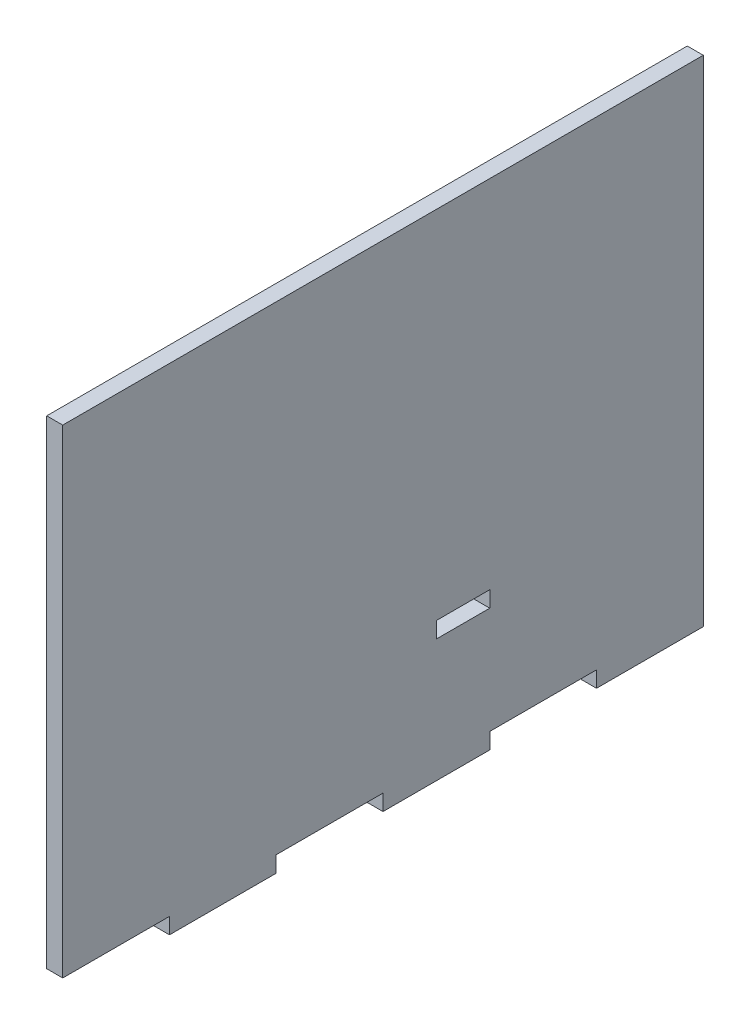
ISO-10303-21;
HEADER;
FILE_DESCRIPTION(('STEP AP214'),'2;1');
FILE_NAME('part.step','',(''),(''),'','','');
FILE_SCHEMA(('AUTOMOTIVE_DESIGN { 1 0 10303 214 1 1 1 1 }'));
ENDSEC;
DATA;
#1=APPLICATION_CONTEXT('core data for automotive mechanical design processes');
#2=APPLICATION_PROTOCOL_DEFINITION('international standard','automotive_design',2000,#1);
#3=PRODUCT_CONTEXT('',#1,'mechanical');
#4=PRODUCT('Part','Part','',(#3));
#5=PRODUCT_RELATED_PRODUCT_CATEGORY('part','',(#4));
#6=PRODUCT_DEFINITION_FORMATION('','',#4);
#7=PRODUCT_DEFINITION_CONTEXT('part definition',#1,'design');
#8=PRODUCT_DEFINITION('design','',#6,#7);
#9=PRODUCT_DEFINITION_SHAPE('','',#8);
#10=(LENGTH_UNIT() NAMED_UNIT(*) SI_UNIT(.MILLI.,.METRE.));
#11=(NAMED_UNIT(*) PLANE_ANGLE_UNIT() SI_UNIT($,.RADIAN.));
#12=(NAMED_UNIT(*) SI_UNIT($,.STERADIAN.) SOLID_ANGLE_UNIT());
#13=UNCERTAINTY_MEASURE_WITH_UNIT(LENGTH_MEASURE(1.E-05),#10,'distance_accuracy_value','');
#14=(GEOMETRIC_REPRESENTATION_CONTEXT(3) GLOBAL_UNCERTAINTY_ASSIGNED_CONTEXT((#13)) GLOBAL_UNIT_ASSIGNED_CONTEXT((#10,
#11,#12)) REPRESENTATION_CONTEXT('',''));
#15=CARTESIAN_POINT('',(0.,0.,0.));
#16=DIRECTION('',(0.,0.,1.));
#17=DIRECTION('',(1.,0.,0.));
#18=AXIS2_PLACEMENT_3D('',#15,#16,#17);
#19=CARTESIAN_POINT('',(3.,-58.6201993364482,0.));
#20=DIRECTION('',(0.,-1.,0.));
#21=DIRECTION('',(0.,0.,-1.));
#22=AXIS2_PLACEMENT_3D('',#19,#20,#21);
#23=PLANE('',#22);
#24=DIRECTION('',(0.,0.,1.));
#25=VECTOR('',#24,1.);
#26=CARTESIAN_POINT('',(0.,-58.6201993364482,0.));
#27=LINE('',#26,#25);
#28=CARTESIAN_POINT('',(0.,-58.6201993364482,-19.4698561832748));
#29=VERTEX_POINT('',#28);
#30=CARTESIAN_POINT('',(0.,-58.6201993364482,-9.4698561832748));
#31=VERTEX_POINT('',#30);
#32=EDGE_CURVE('E221',#29,#31,#27,.T.);
#33=ORIENTED_EDGE('',*,*,#32,.T.);
#34=DIRECTION('',(-1.,0.,0.));
#35=VECTOR('',#34,1.);
#36=CARTESIAN_POINT('',(3.,-58.6201993364482,-9.4698561832748));
#37=LINE('',#36,#35);
#38=CARTESIAN_POINT('',(3.,-58.6201993364482,-9.4698561832748));
#39=VERTEX_POINT('',#38);
#40=EDGE_CURVE('E11',#39,#31,#37,.T.);
#41=ORIENTED_EDGE('',*,*,#40,.F.);
#42=DIRECTION('',(0.,0.,1.));
#43=VECTOR('',#42,1.);
#44=CARTESIAN_POINT('',(3.,-58.6201993364482,0.));
#45=LINE('',#44,#43);
#46=CARTESIAN_POINT('',(3.,-58.6201993364482,-19.4698561832748));
#47=VERTEX_POINT('',#46);
#48=EDGE_CURVE('E173',#47,#39,#45,.T.);
#49=ORIENTED_EDGE('',*,*,#48,.F.);
#50=DIRECTION('',(-1.,0.,0.));
#51=VECTOR('',#50,1.);
#52=CARTESIAN_POINT('',(3.,-58.6201993364482,-19.4698561832748));
#53=LINE('',#52,#51);
#54=EDGE_CURVE('E53',#47,#29,#53,.T.);
#55=ORIENTED_EDGE('',*,*,#54,.T.);
#56=EDGE_LOOP('',(#33,#41,#49,#55));
#57=FACE_BOUND('',#56,.T.);
#58=ADVANCED_FACE('F34',(#57),#23,.F.);
#59=CARTESIAN_POINT('',(3.,0.,-9.4698561832748));
#60=DIRECTION('',(0.,0.,1.));
#61=DIRECTION('',(1.,0.,0.));
#62=AXIS2_PLACEMENT_3D('',#59,#60,#61);
#63=PLANE('',#62);
#64=DIRECTION('',(0.,1.,0.));
#65=VECTOR('',#64,1.);
#66=CARTESIAN_POINT('',(0.,0.,-9.4698561832748));
#67=LINE('',#66,#65);
#68=CARTESIAN_POINT('',(0.,-55.6201993364482,-9.4698561832748));
#69=VERTEX_POINT('',#68);
#70=EDGE_CURVE('E179',#31,#69,#67,.T.);
#71=ORIENTED_EDGE('',*,*,#70,.T.);
#72=DIRECTION('',(-1.,0.,0.));
#73=VECTOR('',#72,1.);
#74=CARTESIAN_POINT('',(3.,-55.6201993364482,-9.4698561832748));
#75=LINE('',#74,#73);
#76=CARTESIAN_POINT('',(3.,-55.6201993364482,-9.4698561832748));
#77=VERTEX_POINT('',#76);
#78=EDGE_CURVE('E44',#77,#69,#75,.T.);
#79=ORIENTED_EDGE('',*,*,#78,.F.);
#80=DIRECTION('',(0.,1.,0.));
#81=VECTOR('',#80,1.);
#82=CARTESIAN_POINT('',(3.,0.,-9.4698561832748));
#83=LINE('',#82,#81);
#84=EDGE_CURVE('E167',#39,#77,#83,.T.);
#85=ORIENTED_EDGE('',*,*,#84,.F.);
#86=ORIENTED_EDGE('',*,*,#40,.T.);
#87=EDGE_LOOP('',(#71,#79,#85,#86));
#88=FACE_BOUND('',#87,.T.);
#89=ADVANCED_FACE('F178',(#88),#63,.F.);
#90=CARTESIAN_POINT('',(3.,-55.6201993364482,0.));
#91=DIRECTION('',(0.,-1.,0.));
#92=DIRECTION('',(0.,0.,-1.));
#93=AXIS2_PLACEMENT_3D('',#90,#91,#92);
#94=PLANE('',#93);
#95=DIRECTION('',(0.,0.,1.));
#96=VECTOR('',#95,1.);
#97=CARTESIAN_POINT('',(0.,-55.6201993364482,0.));
#98=LINE('',#97,#96);
#99=CARTESIAN_POINT('',(0.,-55.6201993364482,-19.4698561832748));
#100=VERTEX_POINT('',#99);
#101=EDGE_CURVE('E224',#100,#69,#98,.T.);
#102=ORIENTED_EDGE('',*,*,#101,.F.);
#103=DIRECTION('',(-1.,0.,0.));
#104=VECTOR('',#103,1.);
#105=CARTESIAN_POINT('',(3.,-55.6201993364482,-19.4698561832748));
#106=LINE('',#105,#104);
#107=CARTESIAN_POINT('',(3.,-55.6201993364482,-19.4698561832748));
#108=VERTEX_POINT('',#107);
#109=EDGE_CURVE('E109',#108,#100,#106,.T.);
#110=ORIENTED_EDGE('',*,*,#109,.F.);
#111=DIRECTION('',(0.,0.,1.));
#112=VECTOR('',#111,1.);
#113=CARTESIAN_POINT('',(3.,-55.6201993364482,0.));
#114=LINE('',#113,#112);
#115=EDGE_CURVE('E172',#108,#77,#114,.T.);
#116=ORIENTED_EDGE('',*,*,#115,.T.);
#117=ORIENTED_EDGE('',*,*,#78,.T.);
#118=EDGE_LOOP('',(#102,#110,#116,#117));
#119=FACE_BOUND('',#118,.T.);
#120=ADVANCED_FACE('F183',(#119),#94,.T.);
#121=CARTESIAN_POINT('',(3.,11.0868676877824,0.));
#122=DIRECTION('',(0.,1.,0.));
#123=DIRECTION('',(0.,0.,1.));
#124=AXIS2_PLACEMENT_3D('',#121,#122,#123);
#125=PLANE('',#124);
#126=DIRECTION('',(0.,0.,-1.));
#127=VECTOR('',#126,1.);
#128=CARTESIAN_POINT('',(0.,11.0868676877824,0.));
#129=LINE('',#128,#127);
#130=CARTESIAN_POINT('',(0.,11.0868676877824,60.5301438167252));
#131=VERTEX_POINT('',#130);
#132=CARTESIAN_POINT('',(0.,11.0868676877824,-59.4698561832748));
#133=VERTEX_POINT('',#132);
#134=EDGE_CURVE('E190',#131,#133,#129,.T.);
#135=ORIENTED_EDGE('',*,*,#134,.F.);
#136=DIRECTION('',(-1.,0.,0.));
#137=VECTOR('',#136,1.);
#138=CARTESIAN_POINT('',(3.,11.0868676877824,60.5301438167252));
#139=LINE('',#138,#137);
#140=CARTESIAN_POINT('',(3.,11.0868676877824,60.5301438167252));
#141=VERTEX_POINT('',#140);
#142=EDGE_CURVE('E38',#141,#131,#139,.T.);
#143=ORIENTED_EDGE('',*,*,#142,.F.);
#144=DIRECTION('',(0.,0.,-1.));
#145=VECTOR('',#144,1.);
#146=CARTESIAN_POINT('',(3.,11.0868676877824,0.));
#147=LINE('',#146,#145);
#148=CARTESIAN_POINT('',(3.,11.0868676877824,-59.4698561832748));
#149=VERTEX_POINT('',#148);
#150=EDGE_CURVE('E229',#141,#149,#147,.T.);
#151=ORIENTED_EDGE('',*,*,#150,.T.);
#152=DIRECTION('',(-1.,0.,0.));
#153=VECTOR('',#152,1.);
#154=CARTESIAN_POINT('',(3.,11.0868676877824,-59.4698561832748));
#155=LINE('',#154,#153);
#156=EDGE_CURVE('E186',#149,#133,#155,.T.);
#157=ORIENTED_EDGE('',*,*,#156,.T.);
#158=EDGE_LOOP('',(#135,#143,#151,#157));
#159=FACE_BOUND('',#158,.T.);
#160=ADVANCED_FACE('F36',(#159),#125,.T.);
#161=CARTESIAN_POINT('',(3.,0.,60.5301438167252));
#162=DIRECTION('',(0.,0.,1.));
#163=DIRECTION('',(1.,0.,0.));
#164=AXIS2_PLACEMENT_3D('',#161,#162,#163);
#165=PLANE('',#164);
#166=DIRECTION('',(0.,1.,0.));
#167=VECTOR('',#166,1.);
#168=CARTESIAN_POINT('',(0.,0.,60.5301438167252));
#169=LINE('',#168,#167);
#170=CARTESIAN_POINT('',(0.,-78.6201993364482,60.5301438167252));
#171=VERTEX_POINT('',#170);
#172=EDGE_CURVE('E193',#171,#131,#169,.T.);
#173=ORIENTED_EDGE('',*,*,#172,.F.);
#174=DIRECTION('',(-1.,0.,0.));
#175=VECTOR('',#174,1.);
#176=CARTESIAN_POINT('',(3.,-78.6201993364482,60.5301438167252));
#177=LINE('',#176,#175);
#178=CARTESIAN_POINT('',(3.,-78.6201993364482,60.5301438167252));
#179=VERTEX_POINT('',#178);
#180=EDGE_CURVE('E265',#179,#171,#177,.T.);
#181=ORIENTED_EDGE('',*,*,#180,.F.);
#182=DIRECTION('',(0.,1.,0.));
#183=VECTOR('',#182,1.);
#184=CARTESIAN_POINT('',(3.,0.,60.5301438167252));
#185=LINE('',#184,#183);
#186=EDGE_CURVE('E274',#179,#141,#185,.T.);
#187=ORIENTED_EDGE('',*,*,#186,.T.);
#188=ORIENTED_EDGE('',*,*,#142,.T.);
#189=EDGE_LOOP('',(#173,#181,#187,#188));
#190=FACE_BOUND('',#189,.T.);
#191=ADVANCED_FACE('F272',(#190),#165,.T.);
#192=CARTESIAN_POINT('',(3.,-78.6201993364482,0.));
#193=DIRECTION('',(0.,1.,0.));
#194=DIRECTION('',(0.,0.,1.));
#195=AXIS2_PLACEMENT_3D('',#192,#193,#194);
#196=PLANE('',#195);
#197=DIRECTION('',(0.,0.,-1.));
#198=VECTOR('',#197,1.);
#199=CARTESIAN_POINT('',(0.,-78.6201993364482,0.));
#200=LINE('',#199,#198);
#201=CARTESIAN_POINT('',(0.,-78.6201993364482,40.5301438167252));
#202=VERTEX_POINT('',#201);
#203=EDGE_CURVE('E196',#171,#202,#200,.T.);
#204=ORIENTED_EDGE('',*,*,#203,.T.);
#205=DIRECTION('',(-1.,0.,0.));
#206=VECTOR('',#205,1.);
#207=CARTESIAN_POINT('',(3.,-78.6201993364482,40.5301438167252));
#208=LINE('',#207,#206);
#209=CARTESIAN_POINT('',(3.,-78.6201993364482,40.5301438167252));
#210=VERTEX_POINT('',#209);
#211=EDGE_CURVE('E263',#210,#202,#208,.T.);
#212=ORIENTED_EDGE('',*,*,#211,.F.);
#213=DIRECTION('',(0.,0.,-1.));
#214=VECTOR('',#213,1.);
#215=CARTESIAN_POINT('',(3.,-78.6201993364482,0.));
#216=LINE('',#215,#214);
#217=EDGE_CURVE('E292',#179,#210,#216,.T.);
#218=ORIENTED_EDGE('',*,*,#217,.F.);
#219=ORIENTED_EDGE('',*,*,#180,.T.);
#220=EDGE_LOOP('',(#204,#212,#218,#219));
#221=FACE_BOUND('',#220,.T.);
#222=ADVANCED_FACE('F283',(#221),#196,.F.);
#223=CARTESIAN_POINT('',(3.,0.,40.5301438167252));
#224=DIRECTION('',(0.,0.,-1.));
#225=DIRECTION('',(-1.,0.,0.));
#226=AXIS2_PLACEMENT_3D('',#223,#224,#225);
#227=PLANE('',#226);
#228=DIRECTION('',(0.,-1.,0.));
#229=VECTOR('',#228,1.);
#230=CARTESIAN_POINT('',(0.,0.,40.5301438167252));
#231=LINE('',#230,#229);
#232=CARTESIAN_POINT('',(0.,-81.6201993364482,40.5301438167252));
#233=VERTEX_POINT('',#232);
#234=EDGE_CURVE('E198',#202,#233,#231,.T.);
#235=ORIENTED_EDGE('',*,*,#234,.T.);
#236=DIRECTION('',(-1.,0.,0.));
#237=VECTOR('',#236,1.);
#238=CARTESIAN_POINT('',(3.,-81.6201993364482,40.5301438167252));
#239=LINE('',#238,#237);
#240=CARTESIAN_POINT('',(3.,-81.6201993364482,40.5301438167252));
#241=VERTEX_POINT('',#240);
#242=EDGE_CURVE('E260',#241,#233,#239,.T.);
#243=ORIENTED_EDGE('',*,*,#242,.F.);
#244=DIRECTION('',(0.,-1.,0.));
#245=VECTOR('',#244,1.);
#246=CARTESIAN_POINT('',(3.,0.,40.5301438167252));
#247=LINE('',#246,#245);
#248=EDGE_CURVE('E288',#210,#241,#247,.T.);
#249=ORIENTED_EDGE('',*,*,#248,.F.);
#250=ORIENTED_EDGE('',*,*,#211,.T.);
#251=EDGE_LOOP('',(#235,#243,#249,#250));
#252=FACE_BOUND('',#251,.T.);
#253=ADVANCED_FACE('F286',(#252),#227,.F.);
#254=CARTESIAN_POINT('',(3.,-81.6201993364482,0.));
#255=DIRECTION('',(0.,1.,0.));
#256=DIRECTION('',(0.,0.,1.));
#257=AXIS2_PLACEMENT_3D('',#254,#255,#256);
#258=PLANE('',#257);
#259=DIRECTION('',(0.,0.,-1.));
#260=VECTOR('',#259,1.);
#261=CARTESIAN_POINT('',(0.,-81.6201993364482,0.));
#262=LINE('',#261,#260);
#263=CARTESIAN_POINT('',(0.,-81.6201993364482,20.5301438167252));
#264=VERTEX_POINT('',#263);
#265=EDGE_CURVE('E200',#233,#264,#262,.T.);
#266=ORIENTED_EDGE('',*,*,#265,.T.);
#267=DIRECTION('',(-1.,0.,0.));
#268=VECTOR('',#267,1.);
#269=CARTESIAN_POINT('',(3.,-81.6201993364482,20.5301438167252));
#270=LINE('',#269,#268);
#271=CARTESIAN_POINT('',(3.,-81.6201993364482,20.5301438167252));
#272=VERTEX_POINT('',#271);
#273=EDGE_CURVE('E257',#272,#264,#270,.T.);
#274=ORIENTED_EDGE('',*,*,#273,.F.);
#275=DIRECTION('',(0.,0.,-1.));
#276=VECTOR('',#275,1.);
#277=CARTESIAN_POINT('',(3.,-81.6201993364482,0.));
#278=LINE('',#277,#276);
#279=EDGE_CURVE('E291',#241,#272,#278,.T.);
#280=ORIENTED_EDGE('',*,*,#279,.F.);
#281=ORIENTED_EDGE('',*,*,#242,.T.);
#282=EDGE_LOOP('',(#266,#274,#280,#281));
#283=FACE_BOUND('',#282,.T.);
#284=ADVANCED_FACE('F361',(#283),#258,.F.);
#285=CARTESIAN_POINT('',(3.,0.,20.5301438167252));
#286=DIRECTION('',(0.,0.,1.));
#287=DIRECTION('',(1.,0.,0.));
#288=AXIS2_PLACEMENT_3D('',#285,#286,#287);
#289=PLANE('',#288);
#290=DIRECTION('',(0.,1.,0.));
#291=VECTOR('',#290,1.);
#292=CARTESIAN_POINT('',(0.,0.,20.5301438167252));
#293=LINE('',#292,#291);
#294=CARTESIAN_POINT('',(0.,-78.6201993364482,20.5301438167252));
#295=VERTEX_POINT('',#294);
#296=EDGE_CURVE('E202',#264,#295,#293,.T.);
#297=ORIENTED_EDGE('',*,*,#296,.T.);
#298=DIRECTION('',(-1.,0.,0.));
#299=VECTOR('',#298,1.);
#300=CARTESIAN_POINT('',(3.,-78.6201993364482,20.5301438167252));
#301=LINE('',#300,#299);
#302=CARTESIAN_POINT('',(3.,-78.6201993364482,20.5301438167252));
#303=VERTEX_POINT('',#302);
#304=EDGE_CURVE('E254',#303,#295,#301,.T.);
#305=ORIENTED_EDGE('',*,*,#304,.F.);
#306=DIRECTION('',(0.,1.,0.));
#307=VECTOR('',#306,1.);
#308=CARTESIAN_POINT('',(3.,0.,20.5301438167252));
#309=LINE('',#308,#307);
#310=EDGE_CURVE('E294',#272,#303,#309,.T.);
#311=ORIENTED_EDGE('',*,*,#310,.F.);
#312=ORIENTED_EDGE('',*,*,#273,.T.);
#313=EDGE_LOOP('',(#297,#305,#311,#312));
#314=FACE_BOUND('',#313,.T.);
#315=ADVANCED_FACE('F358',(#314),#289,.F.);
#316=CARTESIAN_POINT('',(3.,-78.6201993364482,0.));
#317=DIRECTION('',(0.,1.,0.));
#318=DIRECTION('',(0.,0.,1.));
#319=AXIS2_PLACEMENT_3D('',#316,#317,#318);
#320=PLANE('',#319);
#321=DIRECTION('',(0.,0.,-1.));
#322=VECTOR('',#321,1.);
#323=CARTESIAN_POINT('',(0.,-78.6201993364482,0.));
#324=LINE('',#323,#322);
#325=CARTESIAN_POINT('',(0.,-78.6201993364482,0.530143816725214));
#326=VERTEX_POINT('',#325);
#327=EDGE_CURVE('E204',#295,#326,#324,.T.);
#328=ORIENTED_EDGE('',*,*,#327,.T.);
#329=DIRECTION('',(-1.,0.,0.));
#330=VECTOR('',#329,1.);
#331=CARTESIAN_POINT('',(3.,-78.6201993364482,0.530143816725214));
#332=LINE('',#331,#330);
#333=CARTESIAN_POINT('',(3.,-78.6201993364482,0.530143816725214));
#334=VERTEX_POINT('',#333);
#335=EDGE_CURVE('E251',#334,#326,#332,.T.);
#336=ORIENTED_EDGE('',*,*,#335,.F.);
#337=DIRECTION('',(0.,0.,-1.));
#338=VECTOR('',#337,1.);
#339=CARTESIAN_POINT('',(3.,-78.6201993364482,0.));
#340=LINE('',#339,#338);
#341=EDGE_CURVE('E300',#303,#334,#340,.T.);
#342=ORIENTED_EDGE('',*,*,#341,.F.);
#343=ORIENTED_EDGE('',*,*,#304,.T.);
#344=EDGE_LOOP('',(#328,#336,#342,#343));
#345=FACE_BOUND('',#344,.T.);
#346=ADVANCED_FACE('F353',(#345),#320,.F.);
#347=CARTESIAN_POINT('',(3.,0.,0.530143816725214));
#348=DIRECTION('',(0.,0.,-1.));
#349=DIRECTION('',(-1.,0.,0.));
#350=AXIS2_PLACEMENT_3D('',#347,#348,#349);
#351=PLANE('',#350);
#352=DIRECTION('',(0.,-1.,0.));
#353=VECTOR('',#352,1.);
#354=CARTESIAN_POINT('',(0.,0.,0.530143816725214));
#355=LINE('',#354,#353);
#356=CARTESIAN_POINT('',(0.,-81.6201993364482,0.530143816725214));
#357=VERTEX_POINT('',#356);
#358=EDGE_CURVE('E206',#326,#357,#355,.T.);
#359=ORIENTED_EDGE('',*,*,#358,.T.);
#360=DIRECTION('',(-1.,0.,0.));
#361=VECTOR('',#360,1.);
#362=CARTESIAN_POINT('',(3.,-81.6201993364482,0.530143816725214));
#363=LINE('',#362,#361);
#364=CARTESIAN_POINT('',(3.,-81.6201993364482,0.530143816725214));
#365=VERTEX_POINT('',#364);
#366=EDGE_CURVE('E248',#365,#357,#363,.T.);
#367=ORIENTED_EDGE('',*,*,#366,.F.);
#368=DIRECTION('',(0.,-1.,0.));
#369=VECTOR('',#368,1.);
#370=CARTESIAN_POINT('',(3.,0.,0.530143816725214));
#371=LINE('',#370,#369);
#372=EDGE_CURVE('E302',#334,#365,#371,.T.);
#373=ORIENTED_EDGE('',*,*,#372,.F.);
#374=ORIENTED_EDGE('',*,*,#335,.T.);
#375=EDGE_LOOP('',(#359,#367,#373,#374));
#376=FACE_BOUND('',#375,.T.);
#377=ADVANCED_FACE('F348',(#376),#351,.F.);
#378=CARTESIAN_POINT('',(3.,-81.6201993364482,0.));
#379=DIRECTION('',(0.,1.,0.));
#380=DIRECTION('',(0.,0.,1.));
#381=AXIS2_PLACEMENT_3D('',#378,#379,#380);
#382=PLANE('',#381);
#383=DIRECTION('',(0.,0.,-1.));
#384=VECTOR('',#383,1.);
#385=CARTESIAN_POINT('',(0.,-81.6201993364482,0.));
#386=LINE('',#385,#384);
#387=CARTESIAN_POINT('',(0.,-81.6201993364482,-19.4698561832748));
#388=VERTEX_POINT('',#387);
#389=EDGE_CURVE('E208',#357,#388,#386,.T.);
#390=ORIENTED_EDGE('',*,*,#389,.T.);
#391=DIRECTION('',(-1.,0.,0.));
#392=VECTOR('',#391,1.);
#393=CARTESIAN_POINT('',(3.,-81.6201993364482,-19.4698561832748));
#394=LINE('',#393,#392);
#395=CARTESIAN_POINT('',(3.,-81.6201993364482,-19.4698561832748));
#396=VERTEX_POINT('',#395);
#397=EDGE_CURVE('E245',#396,#388,#394,.T.);
#398=ORIENTED_EDGE('',*,*,#397,.F.);
#399=DIRECTION('',(0.,0.,-1.));
#400=VECTOR('',#399,1.);
#401=CARTESIAN_POINT('',(3.,-81.6201993364482,0.));
#402=LINE('',#401,#400);
#403=EDGE_CURVE('E304',#365,#396,#402,.T.);
#404=ORIENTED_EDGE('',*,*,#403,.F.);
#405=ORIENTED_EDGE('',*,*,#366,.T.);
#406=EDGE_LOOP('',(#390,#398,#404,#405));
#407=FACE_BOUND('',#406,.T.);
#408=ADVANCED_FACE('F344',(#407),#382,.F.);
#409=CARTESIAN_POINT('',(3.,0.,-19.4698561832748));
#410=DIRECTION('',(0.,0.,1.));
#411=DIRECTION('',(1.,0.,0.));
#412=AXIS2_PLACEMENT_3D('',#409,#410,#411);
#413=PLANE('',#412);
#414=DIRECTION('',(0.,1.,0.));
#415=VECTOR('',#414,1.);
#416=CARTESIAN_POINT('',(0.,0.,-19.4698561832748));
#417=LINE('',#416,#415);
#418=CARTESIAN_POINT('',(0.,-78.6201993364482,-19.4698561832748));
#419=VERTEX_POINT('',#418);
#420=EDGE_CURVE('E210',#388,#419,#417,.T.);
#421=ORIENTED_EDGE('',*,*,#420,.T.);
#422=DIRECTION('',(-1.,0.,0.));
#423=VECTOR('',#422,1.);
#424=CARTESIAN_POINT('',(3.,-78.6201993364482,-19.4698561832748));
#425=LINE('',#424,#423);
#426=CARTESIAN_POINT('',(3.,-78.6201993364482,-19.4698561832748));
#427=VERTEX_POINT('',#426);
#428=EDGE_CURVE('E242',#427,#419,#425,.T.);
#429=ORIENTED_EDGE('',*,*,#428,.F.);
#430=DIRECTION('',(0.,1.,0.));
#431=VECTOR('',#430,1.);
#432=CARTESIAN_POINT('',(3.,0.,-19.4698561832748));
#433=LINE('',#432,#431);
#434=EDGE_CURVE('E306',#396,#427,#433,.T.);
#435=ORIENTED_EDGE('',*,*,#434,.F.);
#436=ORIENTED_EDGE('',*,*,#397,.T.);
#437=EDGE_LOOP('',(#421,#429,#435,#436));
#438=FACE_BOUND('',#437,.T.);
#439=ADVANCED_FACE('F339',(#438),#413,.F.);
#440=CARTESIAN_POINT('',(3.,-78.6201993364482,0.));
#441=DIRECTION('',(0.,1.,0.));
#442=DIRECTION('',(0.,0.,1.));
#443=AXIS2_PLACEMENT_3D('',#440,#441,#442);
#444=PLANE('',#443);
#445=DIRECTION('',(0.,0.,-1.));
#446=VECTOR('',#445,1.);
#447=CARTESIAN_POINT('',(0.,-78.6201993364482,0.));
#448=LINE('',#447,#446);
#449=CARTESIAN_POINT('',(0.,-78.6201993364482,-39.4698561832748));
#450=VERTEX_POINT('',#449);
#451=EDGE_CURVE('E212',#419,#450,#448,.T.);
#452=ORIENTED_EDGE('',*,*,#451,.T.);
#453=DIRECTION('',(-1.,0.,0.));
#454=VECTOR('',#453,1.);
#455=CARTESIAN_POINT('',(3.,-78.6201993364482,-39.4698561832748));
#456=LINE('',#455,#454);
#457=CARTESIAN_POINT('',(3.,-78.6201993364482,-39.4698561832748));
#458=VERTEX_POINT('',#457);
#459=EDGE_CURVE('E239',#458,#450,#456,.T.);
#460=ORIENTED_EDGE('',*,*,#459,.F.);
#461=DIRECTION('',(0.,0.,-1.));
#462=VECTOR('',#461,1.);
#463=CARTESIAN_POINT('',(3.,-78.6201993364482,0.));
#464=LINE('',#463,#462);
#465=EDGE_CURVE('E308',#427,#458,#464,.T.);
#466=ORIENTED_EDGE('',*,*,#465,.F.);
#467=ORIENTED_EDGE('',*,*,#428,.T.);
#468=EDGE_LOOP('',(#452,#460,#466,#467));
#469=FACE_BOUND('',#468,.T.);
#470=ADVANCED_FACE('F333',(#469),#444,.F.);
#471=CARTESIAN_POINT('',(3.,0.,-39.4698561832748));
#472=DIRECTION('',(0.,0.,-1.));
#473=DIRECTION('',(-1.,0.,0.));
#474=AXIS2_PLACEMENT_3D('',#471,#472,#473);
#475=PLANE('',#474);
#476=DIRECTION('',(0.,-1.,0.));
#477=VECTOR('',#476,1.);
#478=CARTESIAN_POINT('',(0.,0.,-39.4698561832748));
#479=LINE('',#478,#477);
#480=CARTESIAN_POINT('',(0.,-81.6201993364482,-39.4698561832748));
#481=VERTEX_POINT('',#480);
#482=EDGE_CURVE('E214',#450,#481,#479,.T.);
#483=ORIENTED_EDGE('',*,*,#482,.T.);
#484=DIRECTION('',(-1.,0.,0.));
#485=VECTOR('',#484,1.);
#486=CARTESIAN_POINT('',(3.,-81.6201993364482,-39.4698561832748));
#487=LINE('',#486,#485);
#488=CARTESIAN_POINT('',(3.,-81.6201993364482,-39.4698561832748));
#489=VERTEX_POINT('',#488);
#490=EDGE_CURVE('E236',#489,#481,#487,.T.);
#491=ORIENTED_EDGE('',*,*,#490,.F.);
#492=DIRECTION('',(0.,-1.,0.));
#493=VECTOR('',#492,1.);
#494=CARTESIAN_POINT('',(3.,0.,-39.4698561832748));
#495=LINE('',#494,#493);
#496=EDGE_CURVE('E310',#458,#489,#495,.T.);
#497=ORIENTED_EDGE('',*,*,#496,.F.);
#498=ORIENTED_EDGE('',*,*,#459,.T.);
#499=EDGE_LOOP('',(#483,#491,#497,#498));
#500=FACE_BOUND('',#499,.T.);
#501=ADVANCED_FACE('F329',(#500),#475,.F.);
#502=CARTESIAN_POINT('',(3.,-81.6201993364482,0.));
#503=DIRECTION('',(0.,1.,0.));
#504=DIRECTION('',(0.,0.,1.));
#505=AXIS2_PLACEMENT_3D('',#502,#503,#504);
#506=PLANE('',#505);
#507=DIRECTION('',(0.,0.,-1.));
#508=VECTOR('',#507,1.);
#509=CARTESIAN_POINT('',(0.,-81.6201993364482,0.));
#510=LINE('',#509,#508);
#511=CARTESIAN_POINT('',(0.,-81.6201993364482,-59.4698561832748));
#512=VERTEX_POINT('',#511);
#513=EDGE_CURVE('E216',#481,#512,#510,.T.);
#514=ORIENTED_EDGE('',*,*,#513,.T.);
#515=DIRECTION('',(-1.,0.,0.));
#516=VECTOR('',#515,1.);
#517=CARTESIAN_POINT('',(3.,-81.6201993364482,-59.4698561832748));
#518=LINE('',#517,#516);
#519=CARTESIAN_POINT('',(3.,-81.6201993364482,-59.4698561832748));
#520=VERTEX_POINT('',#519);
#521=EDGE_CURVE('E233',#520,#512,#518,.T.);
#522=ORIENTED_EDGE('',*,*,#521,.F.);
#523=DIRECTION('',(0.,0.,-1.));
#524=VECTOR('',#523,1.);
#525=CARTESIAN_POINT('',(3.,-81.6201993364482,0.));
#526=LINE('',#525,#524);
#527=EDGE_CURVE('E312',#489,#520,#526,.T.);
#528=ORIENTED_EDGE('',*,*,#527,.F.);
#529=ORIENTED_EDGE('',*,*,#490,.T.);
#530=EDGE_LOOP('',(#514,#522,#528,#529));
#531=FACE_BOUND('',#530,.T.);
#532=ADVANCED_FACE('F325',(#531),#506,.F.);
#533=CARTESIAN_POINT('',(3.,0.,-59.4698561832748));
#534=DIRECTION('',(0.,0.,1.));
#535=DIRECTION('',(0.,-1.,0.));
#536=AXIS2_PLACEMENT_3D('',#533,#534,#535);
#537=PLANE('',#536);
#538=DIRECTION('',(0.,1.,0.));
#539=VECTOR('',#538,1.);
#540=CARTESIAN_POINT('',(0.,0.,-59.4698561832748));
#541=LINE('',#540,#539);
#542=EDGE_CURVE('E218',#512,#133,#541,.T.);
#543=ORIENTED_EDGE('',*,*,#542,.T.);
#544=ORIENTED_EDGE('',*,*,#156,.F.);
#545=DIRECTION('',(0.,1.,0.));
#546=VECTOR('',#545,1.);
#547=CARTESIAN_POINT('',(3.,0.,-59.4698561832748));
#548=LINE('',#547,#546);
#549=EDGE_CURVE('E314',#520,#149,#548,.T.);
#550=ORIENTED_EDGE('',*,*,#549,.F.);
#551=ORIENTED_EDGE('',*,*,#521,.T.);
#552=EDGE_LOOP('',(#543,#544,#550,#551));
#553=FACE_BOUND('',#552,.T.);
#554=ADVANCED_FACE('F319',(#553),#537,.F.);
#555=CARTESIAN_POINT('',(3.,0.,-19.4698561832748));
#556=DIRECTION('',(0.,0.,1.));
#557=DIRECTION('',(1.,0.,0.));
#558=AXIS2_PLACEMENT_3D('',#555,#556,#557);
#559=PLANE('',#558);
#560=DIRECTION('',(0.,1.,0.));
#561=VECTOR('',#560,1.);
#562=CARTESIAN_POINT('',(0.,0.,-19.4698561832748));
#563=LINE('',#562,#561);
#564=EDGE_CURVE('E226',#29,#100,#563,.T.);
#565=ORIENTED_EDGE('',*,*,#564,.F.);
#566=ORIENTED_EDGE('',*,*,#54,.F.);
#567=DIRECTION('',(0.,1.,0.));
#568=VECTOR('',#567,1.);
#569=CARTESIAN_POINT('',(3.,0.,-19.4698561832748));
#570=LINE('',#569,#568);
#571=EDGE_CURVE('E184',#47,#108,#570,.T.);
#572=ORIENTED_EDGE('',*,*,#571,.T.);
#573=ORIENTED_EDGE('',*,*,#109,.T.);
#574=EDGE_LOOP('',(#565,#566,#572,#573));
#575=FACE_BOUND('',#574,.T.);
#576=ADVANCED_FACE('F380',(#575),#559,.T.);
#577=CARTESIAN_POINT('',(3.,0.,0.));
#578=DIRECTION('',(1.,0.,0.));
#579=DIRECTION('',(0.,0.,-1.));
#580=AXIS2_PLACEMENT_3D('',#577,#578,#579);
#581=PLANE('',#580);
#582=ORIENTED_EDGE('',*,*,#150,.F.);
#583=ORIENTED_EDGE('',*,*,#186,.F.);
#584=ORIENTED_EDGE('',*,*,#217,.T.);
#585=ORIENTED_EDGE('',*,*,#248,.T.);
#586=ORIENTED_EDGE('',*,*,#279,.T.);
#587=ORIENTED_EDGE('',*,*,#310,.T.);
#588=ORIENTED_EDGE('',*,*,#341,.T.);
#589=ORIENTED_EDGE('',*,*,#372,.T.);
#590=ORIENTED_EDGE('',*,*,#403,.T.);
#591=ORIENTED_EDGE('',*,*,#434,.T.);
#592=ORIENTED_EDGE('',*,*,#465,.T.);
#593=ORIENTED_EDGE('',*,*,#496,.T.);
#594=ORIENTED_EDGE('',*,*,#527,.T.);
#595=ORIENTED_EDGE('',*,*,#549,.T.);
#596=EDGE_LOOP('',(#582,#583,#584,#585,#586,#587,#588,#589,#590,#591,#592,#593,#594,#595));
#597=FACE_BOUND('',#596,.T.);
#598=ORIENTED_EDGE('',*,*,#48,.T.);
#599=ORIENTED_EDGE('',*,*,#84,.T.);
#600=ORIENTED_EDGE('',*,*,#115,.F.);
#601=ORIENTED_EDGE('',*,*,#571,.F.);
#602=EDGE_LOOP('',(#598,#599,#600,#601));
#603=FACE_BOUND('',#602,.T.);
#604=ADVANCED_FACE('F169',(#597,#603),#581,.T.);
#605=CARTESIAN_POINT('',(0.,0.,0.));
#606=DIRECTION('',(1.,0.,0.));
#607=DIRECTION('',(0.,0.,-1.));
#608=AXIS2_PLACEMENT_3D('',#605,#606,#607);
#609=PLANE('',#608);
#610=ORIENTED_EDGE('',*,*,#134,.T.);
#611=ORIENTED_EDGE('',*,*,#542,.F.);
#612=ORIENTED_EDGE('',*,*,#513,.F.);
#613=ORIENTED_EDGE('',*,*,#482,.F.);
#614=ORIENTED_EDGE('',*,*,#451,.F.);
#615=ORIENTED_EDGE('',*,*,#420,.F.);
#616=ORIENTED_EDGE('',*,*,#389,.F.);
#617=ORIENTED_EDGE('',*,*,#358,.F.);
#618=ORIENTED_EDGE('',*,*,#327,.F.);
#619=ORIENTED_EDGE('',*,*,#296,.F.);
#620=ORIENTED_EDGE('',*,*,#265,.F.);
#621=ORIENTED_EDGE('',*,*,#234,.F.);
#622=ORIENTED_EDGE('',*,*,#203,.F.);
#623=ORIENTED_EDGE('',*,*,#172,.T.);
#624=EDGE_LOOP('',(#610,#611,#612,#613,#614,#615,#616,#617,#618,#619,#620,#621,#622,#623));
#625=FACE_BOUND('',#624,.T.);
#626=ORIENTED_EDGE('',*,*,#32,.F.);
#627=ORIENTED_EDGE('',*,*,#564,.T.);
#628=ORIENTED_EDGE('',*,*,#101,.T.);
#629=ORIENTED_EDGE('',*,*,#70,.F.);
#630=EDGE_LOOP('',(#626,#627,#628,#629));
#631=FACE_BOUND('',#630,.T.);
#632=ADVANCED_FACE('F278',(#625,#631),#609,.F.);
#633=CLOSED_SHELL('',(#58,#89,#120,#160,#191,#222,#253,#284,#315,#346,#377,#408,#439,#470,#501,
#532,#554,#576,#604,#632));
#634=MANIFOLD_SOLID_BREP('B2',#633);
#635=ADVANCED_BREP_SHAPE_REPRESENTATION('',(#18,#634),#14);
#636=SHAPE_DEFINITION_REPRESENTATION(#9,#635);
ENDSEC;
END-ISO-10303-21;
